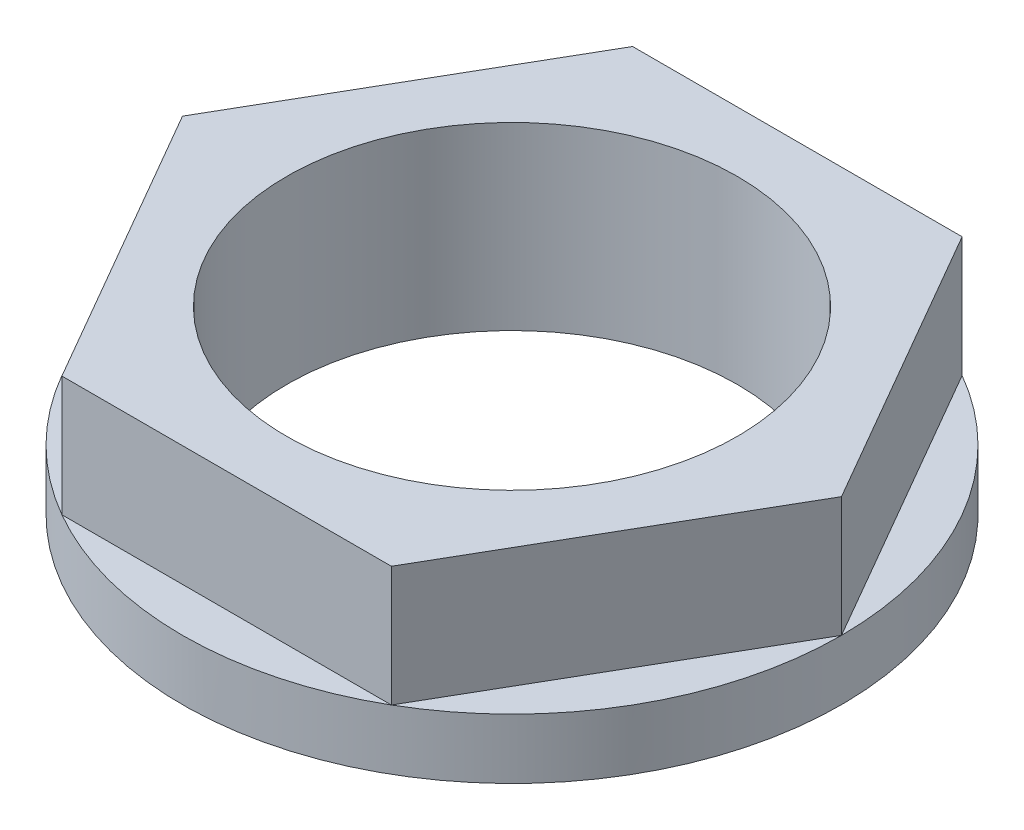
ISO-10303-21;
HEADER;
FILE_DESCRIPTION(('STEP AP214'),'2;1');
FILE_NAME('part.step','',(''),(''),'','','');
FILE_SCHEMA(('AUTOMOTIVE_DESIGN { 1 0 10303 214 1 1 1 1 }'));
ENDSEC;
DATA;
#1=APPLICATION_CONTEXT('core data for automotive mechanical design processes');
#2=APPLICATION_PROTOCOL_DEFINITION('international standard','automotive_design',2000,#1);
#3=PRODUCT_CONTEXT('',#1,'mechanical');
#4=PRODUCT('Part','Part','',(#3));
#5=PRODUCT_RELATED_PRODUCT_CATEGORY('part','',(#4));
#6=PRODUCT_DEFINITION_FORMATION('','',#4);
#7=PRODUCT_DEFINITION_CONTEXT('part definition',#1,'design');
#8=PRODUCT_DEFINITION('design','',#6,#7);
#9=PRODUCT_DEFINITION_SHAPE('','',#8);
#10=(LENGTH_UNIT() NAMED_UNIT(*) SI_UNIT(.MILLI.,.METRE.));
#11=(NAMED_UNIT(*) PLANE_ANGLE_UNIT() SI_UNIT($,.RADIAN.));
#12=(NAMED_UNIT(*) SI_UNIT($,.STERADIAN.) SOLID_ANGLE_UNIT());
#13=UNCERTAINTY_MEASURE_WITH_UNIT(LENGTH_MEASURE(1.E-05),#10,'distance_accuracy_value','');
#14=(GEOMETRIC_REPRESENTATION_CONTEXT(3) GLOBAL_UNCERTAINTY_ASSIGNED_CONTEXT((#13)) GLOBAL_UNIT_ASSIGNED_CONTEXT((#10,
#11,#12)) REPRESENTATION_CONTEXT('',''));
#15=CARTESIAN_POINT('',(0.,0.,0.));
#16=DIRECTION('',(0.,0.,1.));
#17=DIRECTION('',(1.,0.,0.));
#18=AXIS2_PLACEMENT_3D('',#15,#16,#17);
#19=CARTESIAN_POINT('',(-10.9696551146029,4.,0.));
#20=DIRECTION('',(0.86602540378444,0.,0.499999999999998));
#21=DIRECTION('',(0.499999999999998,0.,-0.86602540378444));
#22=AXIS2_PLACEMENT_3D('',#19,#20,#21);
#23=PLANE('',#22);
#24=DIRECTION('',(-0.499999999999998,0.,0.86602540378444));
#25=VECTOR('',#24,1.);
#26=CARTESIAN_POINT('',(-10.9696551146029,0.,0.));
#27=LINE('',#26,#25);
#28=CARTESIAN_POINT('',(-5.48482755730146,0.,-9.5));
#29=VERTEX_POINT('',#28);
#30=CARTESIAN_POINT('',(-10.9696551146029,0.,0.));
#31=VERTEX_POINT('',#30);
#32=EDGE_CURVE('E146',#29,#31,#27,.T.);
#33=ORIENTED_EDGE('',*,*,#32,.T.);
#34=DIRECTION('',(0.,-1.,0.));
#35=VECTOR('',#34,1.);
#36=CARTESIAN_POINT('',(-10.9696551146029,4.,0.));
#37=LINE('',#36,#35);
#38=CARTESIAN_POINT('',(-10.9696551146029,4.,0.));
#39=VERTEX_POINT('',#38);
#40=EDGE_CURVE('E11',#39,#31,#37,.T.);
#41=ORIENTED_EDGE('',*,*,#40,.F.);
#42=DIRECTION('',(-0.499999999999998,0.,0.86602540378444));
#43=VECTOR('',#42,1.);
#44=CARTESIAN_POINT('',(-10.9696551146029,4.,0.));
#45=LINE('',#44,#43);
#46=CARTESIAN_POINT('',(-5.48482755730146,4.,-9.5));
#47=VERTEX_POINT('',#46);
#48=EDGE_CURVE('E89',#47,#39,#45,.T.);
#49=ORIENTED_EDGE('',*,*,#48,.F.);
#50=DIRECTION('',(0.,-1.,0.));
#51=VECTOR('',#50,1.);
#52=CARTESIAN_POINT('',(-5.48482755730146,4.,-9.5));
#53=LINE('',#52,#51);
#54=EDGE_CURVE('E119',#47,#29,#53,.T.);
#55=ORIENTED_EDGE('',*,*,#54,.T.);
#56=EDGE_LOOP('',(#33,#41,#49,#55));
#57=FACE_BOUND('',#56,.T.);
#58=ADVANCED_FACE('F29',(#57),#23,.F.);
#59=CARTESIAN_POINT('',(-5.48482755730141,4.,9.5));
#60=DIRECTION('',(0.866025403784436,0.,-0.500000000000005));
#61=DIRECTION('',(-0.500000000000005,0.,-0.866025403784436));
#62=AXIS2_PLACEMENT_3D('',#59,#60,#61);
#63=PLANE('',#62);
#64=DIRECTION('',(0.500000000000005,0.,0.866025403784436));
#65=VECTOR('',#64,1.);
#66=CARTESIAN_POINT('',(-5.48482755730141,0.,9.5));
#67=LINE('',#66,#65);
#68=CARTESIAN_POINT('',(-5.48482755730141,0.,9.5));
#69=VERTEX_POINT('',#68);
#70=EDGE_CURVE('E141',#31,#69,#67,.T.);
#71=ORIENTED_EDGE('',*,*,#70,.T.);
#72=DIRECTION('',(0.,-1.,0.));
#73=VECTOR('',#72,1.);
#74=CARTESIAN_POINT('',(-5.48482755730141,4.,9.5));
#75=LINE('',#74,#73);
#76=CARTESIAN_POINT('',(-5.48482755730141,4.,9.5));
#77=VERTEX_POINT('',#76);
#78=EDGE_CURVE('E36',#77,#69,#75,.T.);
#79=ORIENTED_EDGE('',*,*,#78,.F.);
#80=DIRECTION('',(0.500000000000005,0.,0.866025403784436));
#81=VECTOR('',#80,1.);
#82=CARTESIAN_POINT('',(-5.48482755730141,4.,9.5));
#83=LINE('',#82,#81);
#84=EDGE_CURVE('E140',#39,#77,#83,.T.);
#85=ORIENTED_EDGE('',*,*,#84,.F.);
#86=ORIENTED_EDGE('',*,*,#40,.T.);
#87=EDGE_LOOP('',(#71,#79,#85,#86));
#88=FACE_BOUND('',#87,.T.);
#89=ADVANCED_FACE('F139',(#88),#63,.F.);
#90=CARTESIAN_POINT('',(5.48482755730142,4.,9.5));
#91=DIRECTION('',(0.,0.,-1.));
#92=DIRECTION('',(-1.,0.,0.));
#93=AXIS2_PLACEMENT_3D('',#90,#91,#92);
#94=PLANE('',#93);
#95=DIRECTION('',(1.,0.,0.));
#96=VECTOR('',#95,1.);
#97=CARTESIAN_POINT('',(5.48482755730142,0.,9.5));
#98=LINE('',#97,#96);
#99=CARTESIAN_POINT('',(5.48482755730146,0.,9.5));
#100=VERTEX_POINT('',#99);
#101=EDGE_CURVE('E135',#69,#100,#98,.T.);
#102=ORIENTED_EDGE('',*,*,#101,.T.);
#103=DIRECTION('',(0.,-1.,0.));
#104=VECTOR('',#103,1.);
#105=CARTESIAN_POINT('',(5.48482755730142,4.,9.5));
#106=LINE('',#105,#104);
#107=CARTESIAN_POINT('',(5.48482755730142,4.,9.5));
#108=VERTEX_POINT('',#107);
#109=EDGE_CURVE('E121',#108,#100,#106,.T.);
#110=ORIENTED_EDGE('',*,*,#109,.F.);
#111=DIRECTION('',(1.,0.,0.));
#112=VECTOR('',#111,1.);
#113=CARTESIAN_POINT('',(5.48482755730142,4.,9.5));
#114=LINE('',#113,#112);
#115=EDGE_CURVE('E136',#77,#108,#114,.T.);
#116=ORIENTED_EDGE('',*,*,#115,.F.);
#117=ORIENTED_EDGE('',*,*,#78,.T.);
#118=EDGE_LOOP('',(#102,#110,#116,#117));
#119=FACE_BOUND('',#118,.T.);
#120=ADVANCED_FACE('F132',(#119),#94,.F.);
#121=CARTESIAN_POINT('',(10.9696551146029,4.,0.));
#122=DIRECTION('',(-0.866025403784436,0.,-0.500000000000004));
#123=DIRECTION('',(-0.500000000000004,0.,0.866025403784436));
#124=AXIS2_PLACEMENT_3D('',#121,#122,#123);
#125=PLANE('',#124);
#126=DIRECTION('',(0.500000000000004,0.,-0.866025403784436));
#127=VECTOR('',#126,1.);
#128=CARTESIAN_POINT('',(10.9696551146029,0.,0.));
#129=LINE('',#128,#127);
#130=CARTESIAN_POINT('',(10.9696551146029,0.,0.));
#131=VERTEX_POINT('',#130);
#132=EDGE_CURVE('E116',#100,#131,#129,.T.);
#133=ORIENTED_EDGE('',*,*,#132,.T.);
#134=DIRECTION('',(0.,-1.,0.));
#135=VECTOR('',#134,1.);
#136=CARTESIAN_POINT('',(10.9696551146029,4.,0.));
#137=LINE('',#136,#135);
#138=CARTESIAN_POINT('',(10.9696551146029,4.,0.));
#139=VERTEX_POINT('',#138);
#140=EDGE_CURVE('E115',#139,#131,#137,.T.);
#141=ORIENTED_EDGE('',*,*,#140,.F.);
#142=DIRECTION('',(0.500000000000004,0.,-0.866025403784436));
#143=VECTOR('',#142,1.);
#144=CARTESIAN_POINT('',(10.9696551146029,4.,0.));
#145=LINE('',#144,#143);
#146=EDGE_CURVE('E156',#108,#139,#145,.T.);
#147=ORIENTED_EDGE('',*,*,#146,.F.);
#148=ORIENTED_EDGE('',*,*,#109,.T.);
#149=EDGE_LOOP('',(#133,#141,#147,#148));
#150=FACE_BOUND('',#149,.T.);
#151=ADVANCED_FACE('F161',(#150),#125,.F.);
#152=CARTESIAN_POINT('',(5.48482755730146,4.,-9.5));
#153=DIRECTION('',(-0.86602540378444,0.,0.499999999999998));
#154=DIRECTION('',(0.499999999999998,0.,0.86602540378444));
#155=AXIS2_PLACEMENT_3D('',#152,#153,#154);
#156=PLANE('',#155);
#157=DIRECTION('',(-0.499999999999998,0.,-0.86602540378444));
#158=VECTOR('',#157,1.);
#159=CARTESIAN_POINT('',(5.48482755730146,0.,-9.5));
#160=LINE('',#159,#158);
#161=CARTESIAN_POINT('',(5.48482755730146,0.,-9.5));
#162=VERTEX_POINT('',#161);
#163=EDGE_CURVE('E90',#131,#162,#160,.T.);
#164=ORIENTED_EDGE('',*,*,#163,.T.);
#165=DIRECTION('',(0.,-1.,0.));
#166=VECTOR('',#165,1.);
#167=CARTESIAN_POINT('',(5.48482755730146,4.,-9.5));
#168=LINE('',#167,#166);
#169=CARTESIAN_POINT('',(5.48482755730146,4.,-9.5));
#170=VERTEX_POINT('',#169);
#171=EDGE_CURVE('E113',#170,#162,#168,.T.);
#172=ORIENTED_EDGE('',*,*,#171,.F.);
#173=DIRECTION('',(-0.499999999999998,0.,-0.86602540378444));
#174=VECTOR('',#173,1.);
#175=CARTESIAN_POINT('',(5.48482755730146,4.,-9.5));
#176=LINE('',#175,#174);
#177=EDGE_CURVE('E48',#139,#170,#176,.T.);
#178=ORIENTED_EDGE('',*,*,#177,.F.);
#179=ORIENTED_EDGE('',*,*,#140,.T.);
#180=EDGE_LOOP('',(#164,#172,#178,#179));
#181=FACE_BOUND('',#180,.T.);
#182=ADVANCED_FACE('F112',(#181),#156,.F.);
#183=CARTESIAN_POINT('',(-5.48482755730146,4.,-9.5));
#184=DIRECTION('',(0.,0.,1.));
#185=DIRECTION('',(1.,0.,0.));
#186=AXIS2_PLACEMENT_3D('',#183,#184,#185);
#187=PLANE('',#186);
#188=DIRECTION('',(-1.,0.,0.));
#189=VECTOR('',#188,1.);
#190=CARTESIAN_POINT('',(-5.48482755730146,0.,-9.5));
#191=LINE('',#190,#189);
#192=EDGE_CURVE('E81',#162,#29,#191,.T.);
#193=ORIENTED_EDGE('',*,*,#192,.T.);
#194=ORIENTED_EDGE('',*,*,#54,.F.);
#195=DIRECTION('',(-1.,0.,0.));
#196=VECTOR('',#195,1.);
#197=CARTESIAN_POINT('',(-5.48482755730146,4.,-9.5));
#198=LINE('',#197,#196);
#199=EDGE_CURVE('E43',#170,#47,#198,.T.);
#200=ORIENTED_EDGE('',*,*,#199,.F.);
#201=ORIENTED_EDGE('',*,*,#171,.T.);
#202=EDGE_LOOP('',(#193,#194,#200,#201));
#203=FACE_BOUND('',#202,.T.);
#204=ADVANCED_FACE('F118',(#203),#187,.F.);
#205=CARTESIAN_POINT('',(-5.48482755730146,4.,-9.5));
#206=DIRECTION('',(0.,-1.,0.));
#207=DIRECTION('',(0.,0.,-1.));
#208=AXIS2_PLACEMENT_3D('',#205,#206,#207);
#209=PLANE('',#208);
#210=CARTESIAN_POINT('',(0.,4.,0.));
#211=DIRECTION('',(0.,-1.,0.));
#212=DIRECTION('',(0.,0.,-1.));
#213=AXIS2_PLACEMENT_3D('',#210,#211,#212);
#214=CIRCLE('',#213,7.5);
#215=CARTESIAN_POINT('',(0.,4.,-7.5));
#216=VERTEX_POINT('',#215);
#217=EDGE_CURVE('E102',#216,#216,#214,.T.);
#218=ORIENTED_EDGE('',*,*,#217,.T.);
#219=EDGE_LOOP('',(#218));
#220=FACE_BOUND('',#219,.T.);
#221=ORIENTED_EDGE('',*,*,#48,.T.);
#222=ORIENTED_EDGE('',*,*,#84,.T.);
#223=ORIENTED_EDGE('',*,*,#115,.T.);
#224=ORIENTED_EDGE('',*,*,#146,.T.);
#225=ORIENTED_EDGE('',*,*,#177,.T.);
#226=ORIENTED_EDGE('',*,*,#199,.T.);
#227=EDGE_LOOP('',(#221,#222,#223,#224,#225,#226));
#228=FACE_BOUND('',#227,.T.);
#229=ADVANCED_FACE('F159',(#220,#228),#209,.F.);
#230=CARTESIAN_POINT('',(0.,0.,0.));
#231=DIRECTION('',(0.,-1.,0.));
#232=DIRECTION('',(0.,0.,-1.));
#233=AXIS2_PLACEMENT_3D('',#230,#231,#232);
#234=PLANE('',#233);
#235=ORIENTED_EDGE('',*,*,#32,.F.);
#236=CARTESIAN_POINT('',(0.,0.,0.));
#237=DIRECTION('',(0.,-1.,0.));
#238=DIRECTION('',(0.,0.,-1.));
#239=AXIS2_PLACEMENT_3D('',#236,#237,#238);
#240=CIRCLE('',#239,10.9696551146029);
#241=EDGE_CURVE('E101',#31,#29,#240,.T.);
#242=ORIENTED_EDGE('',*,*,#241,.F.);
#243=EDGE_LOOP('',(#235,#242));
#244=FACE_BOUND('',#243,.T.);
#245=ADVANCED_FACE('F195',(#244),#234,.F.);
#246=ORIENTED_EDGE('',*,*,#192,.F.);
#247=EDGE_CURVE('E84',#29,#162,#240,.T.);
#248=ORIENTED_EDGE('',*,*,#247,.F.);
#249=EDGE_LOOP('',(#246,#248));
#250=FACE_BOUND('',#249,.T.);
#251=ADVANCED_FACE('F83',(#250),#234,.F.);
#252=ORIENTED_EDGE('',*,*,#163,.F.);
#253=EDGE_CURVE('E97',#162,#131,#240,.T.);
#254=ORIENTED_EDGE('',*,*,#253,.F.);
#255=EDGE_LOOP('',(#252,#254));
#256=FACE_BOUND('',#255,.T.);
#257=ADVANCED_FACE('F106',(#256),#234,.F.);
#258=ORIENTED_EDGE('',*,*,#132,.F.);
#259=EDGE_CURVE('E109',#131,#100,#240,.T.);
#260=ORIENTED_EDGE('',*,*,#259,.F.);
#261=EDGE_LOOP('',(#258,#260));
#262=FACE_BOUND('',#261,.T.);
#263=ADVANCED_FACE('F164',(#262),#234,.F.);
#264=ORIENTED_EDGE('',*,*,#101,.F.);
#265=EDGE_CURVE('E166',#100,#69,#240,.T.);
#266=ORIENTED_EDGE('',*,*,#265,.F.);
#267=EDGE_LOOP('',(#264,#266));
#268=FACE_BOUND('',#267,.T.);
#269=ADVANCED_FACE('F167',(#268),#234,.F.);
#270=CARTESIAN_POINT('',(0.,-2.,0.));
#271=DIRECTION('',(0.,1.,0.));
#272=DIRECTION('',(0.,0.,1.));
#273=AXIS2_PLACEMENT_3D('',#270,#271,#272);
#274=CYLINDRICAL_SURFACE('',#273,10.9696551146029);
#275=CARTESIAN_POINT('',(0.,-2.,0.));
#276=DIRECTION('',(0.,-1.,0.));
#277=DIRECTION('',(0.,0.,-1.));
#278=AXIS2_PLACEMENT_3D('',#275,#276,#277);
#279=CIRCLE('',#278,10.9696551146029);
#280=CARTESIAN_POINT('',(0.,-2.,-10.9696551146029));
#281=VERTEX_POINT('',#280);
#282=EDGE_CURVE('E108',#281,#281,#279,.T.);
#283=ORIENTED_EDGE('',*,*,#282,.F.);
#284=EDGE_LOOP('',(#283));
#285=FACE_BOUND('',#284,.T.);
#286=ORIENTED_EDGE('',*,*,#253,.T.);
#287=ORIENTED_EDGE('',*,*,#259,.T.);
#288=ORIENTED_EDGE('',*,*,#265,.T.);
#289=EDGE_CURVE('E168',#69,#31,#240,.T.);
#290=ORIENTED_EDGE('',*,*,#289,.T.);
#291=ORIENTED_EDGE('',*,*,#241,.T.);
#292=ORIENTED_EDGE('',*,*,#247,.T.);
#293=EDGE_LOOP('',(#286,#287,#288,#290,#291,#292));
#294=FACE_BOUND('',#293,.T.);
#295=ADVANCED_FACE('F95',(#285,#294),#274,.T.);
#296=CARTESIAN_POINT('',(0.,-2.,0.));
#297=DIRECTION('',(0.,-1.,0.));
#298=DIRECTION('',(0.,0.,-1.));
#299=AXIS2_PLACEMENT_3D('',#296,#297,#298);
#300=PLANE('',#299);
#301=CARTESIAN_POINT('',(0.,-2.,0.));
#302=DIRECTION('',(0.,-1.,0.));
#303=DIRECTION('',(0.,0.,-1.));
#304=AXIS2_PLACEMENT_3D('',#301,#302,#303);
#305=CIRCLE('',#304,7.5);
#306=CARTESIAN_POINT('',(0.,-2.,-7.5));
#307=VERTEX_POINT('',#306);
#308=EDGE_CURVE('E276',#307,#307,#305,.T.);
#309=ORIENTED_EDGE('',*,*,#308,.F.);
#310=EDGE_LOOP('',(#309));
#311=FACE_BOUND('',#310,.T.);
#312=ORIENTED_EDGE('',*,*,#282,.T.);
#313=EDGE_LOOP('',(#312));
#314=FACE_BOUND('',#313,.T.);
#315=ADVANCED_FACE('F174',(#311,#314),#300,.T.);
#316=ORIENTED_EDGE('',*,*,#70,.F.);
#317=ORIENTED_EDGE('',*,*,#289,.F.);
#318=EDGE_LOOP('',(#316,#317));
#319=FACE_BOUND('',#318,.T.);
#320=ADVANCED_FACE('F183',(#319),#234,.F.);
#321=CARTESIAN_POINT('',(0.,4.,0.));
#322=DIRECTION('',(0.,-1.,0.));
#323=DIRECTION('',(0.,0.,-1.));
#324=AXIS2_PLACEMENT_3D('',#321,#322,#323);
#325=CYLINDRICAL_SURFACE('',#324,7.5);
#326=ORIENTED_EDGE('',*,*,#217,.F.);
#327=EDGE_LOOP('',(#326));
#328=FACE_BOUND('',#327,.T.);
#329=ORIENTED_EDGE('',*,*,#308,.T.);
#330=EDGE_LOOP('',(#329));
#331=FACE_BOUND('',#330,.T.);
#332=ADVANCED_FACE('F196',(#328,#331),#325,.F.);
#333=CLOSED_SHELL('',(#58,#89,#120,#151,#182,#204,#229,#245,#251,#257,#263,#269,#295,#315,#320,#332));
#334=MANIFOLD_SOLID_BREP('B2',#333);
#335=ADVANCED_BREP_SHAPE_REPRESENTATION('',(#18,#334),#14);
#336=SHAPE_DEFINITION_REPRESENTATION(#9,#335);
ENDSEC;
END-ISO-10303-21;
